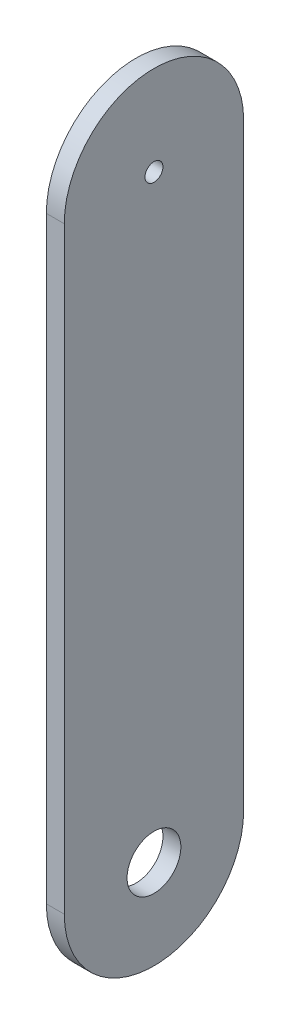
ISO-10303-21;
HEADER;
FILE_DESCRIPTION(('STEP AP214'),'2;1');
FILE_NAME('part.step','',(''),(''),'','','');
FILE_SCHEMA(('AUTOMOTIVE_DESIGN { 1 0 10303 214 1 1 1 1 }'));
ENDSEC;
DATA;
#1=APPLICATION_CONTEXT('core data for automotive mechanical design processes');
#2=APPLICATION_PROTOCOL_DEFINITION('international standard','automotive_design',2000,#1);
#3=PRODUCT_CONTEXT('',#1,'mechanical');
#4=PRODUCT('Part','Part','',(#3));
#5=PRODUCT_RELATED_PRODUCT_CATEGORY('part','',(#4));
#6=PRODUCT_DEFINITION_FORMATION('','',#4);
#7=PRODUCT_DEFINITION_CONTEXT('part definition',#1,'design');
#8=PRODUCT_DEFINITION('design','',#6,#7);
#9=PRODUCT_DEFINITION_SHAPE('','',#8);
#10=(LENGTH_UNIT() NAMED_UNIT(*) SI_UNIT(.MILLI.,.METRE.));
#11=(NAMED_UNIT(*) PLANE_ANGLE_UNIT() SI_UNIT($,.RADIAN.));
#12=(NAMED_UNIT(*) SI_UNIT($,.STERADIAN.) SOLID_ANGLE_UNIT());
#13=UNCERTAINTY_MEASURE_WITH_UNIT(LENGTH_MEASURE(1.E-05),#10,'distance_accuracy_value','');
#14=(GEOMETRIC_REPRESENTATION_CONTEXT(3) GLOBAL_UNCERTAINTY_ASSIGNED_CONTEXT((#13)) GLOBAL_UNIT_ASSIGNED_CONTEXT((#10,
#11,#12)) REPRESENTATION_CONTEXT('',''));
#15=CARTESIAN_POINT('',(0.,0.,0.));
#16=DIRECTION('',(0.,0.,1.));
#17=DIRECTION('',(1.,0.,0.));
#18=AXIS2_PLACEMENT_3D('',#15,#16,#17);
#19=CARTESIAN_POINT('',(3.,-50.,14.8301773529148));
#20=DIRECTION('',(-1.,0.,0.));
#21=DIRECTION('',(0.,0.,1.));
#22=AXIS2_PLACEMENT_3D('',#19,#20,#21);
#23=PLANE('',#22);
#24=CARTESIAN_POINT('',(3.,50.,14.8301773529148));
#25=DIRECTION('',(1.,0.,0.));
#26=DIRECTION('',(0.,0.,-1.));
#27=AXIS2_PLACEMENT_3D('',#24,#25,#26);
#28=CIRCLE('',#27,1.5);
#29=CARTESIAN_POINT('',(3.,50.,13.3301773529148));
#30=VERTEX_POINT('',#29);
#31=EDGE_CURVE('E145',#30,#30,#28,.T.);
#32=ORIENTED_EDGE('',*,*,#31,.F.);
#33=EDGE_LOOP('',(#32));
#34=FACE_BOUND('',#33,.T.);
#35=CARTESIAN_POINT('',(3.,-50.,14.8301773529148));
#36=DIRECTION('',(1.,0.,0.));
#37=DIRECTION('',(0.,0.,1.));
#38=AXIS2_PLACEMENT_3D('',#35,#36,#37);
#39=CIRCLE('',#38,15.);
#40=CARTESIAN_POINT('',(3.,-50.,29.8301773529148));
#41=VERTEX_POINT('',#40);
#42=CARTESIAN_POINT('',(3.,-50.,-0.169822647085245));
#43=VERTEX_POINT('',#42);
#44=EDGE_CURVE('E99',#41,#43,#39,.T.);
#45=ORIENTED_EDGE('',*,*,#44,.T.);
#46=DIRECTION('',(0.,1.,0.));
#47=VECTOR('',#46,1.);
#48=CARTESIAN_POINT('',(3.,50.,-0.169822647085245));
#49=LINE('',#48,#47);
#50=CARTESIAN_POINT('',(3.,50.,-0.169822647085245));
#51=VERTEX_POINT('',#50);
#52=EDGE_CURVE('E94',#43,#51,#49,.T.);
#53=ORIENTED_EDGE('',*,*,#52,.T.);
#54=CARTESIAN_POINT('',(3.,50.,14.8301773529148));
#55=DIRECTION('',(1.,0.,0.));
#56=DIRECTION('',(0.,0.,-1.));
#57=AXIS2_PLACEMENT_3D('',#54,#55,#56);
#58=CIRCLE('',#57,15.);
#59=CARTESIAN_POINT('',(3.,50.,29.8301773529148));
#60=VERTEX_POINT('',#59);
#61=EDGE_CURVE('E97',#51,#60,#58,.T.);
#62=ORIENTED_EDGE('',*,*,#61,.T.);
#63=DIRECTION('',(0.,-1.,0.));
#64=VECTOR('',#63,1.);
#65=CARTESIAN_POINT('',(3.,50.,29.8301773529148));
#66=LINE('',#65,#64);
#67=EDGE_CURVE('E64',#60,#41,#66,.T.);
#68=ORIENTED_EDGE('',*,*,#67,.T.);
#69=EDGE_LOOP('',(#45,#53,#62,#68));
#70=FACE_BOUND('',#69,.T.);
#71=CARTESIAN_POINT('',(3.,-50.,14.8301773529148));
#72=DIRECTION('',(1.,0.,0.));
#73=DIRECTION('',(0.,0.,-1.));
#74=AXIS2_PLACEMENT_3D('',#71,#72,#73);
#75=CIRCLE('',#74,4.5);
#76=CARTESIAN_POINT('',(3.,-50.,10.3301773529148));
#77=VERTEX_POINT('',#76);
#78=EDGE_CURVE('E120',#77,#77,#75,.T.);
#79=ORIENTED_EDGE('',*,*,#78,.F.);
#80=EDGE_LOOP('',(#79));
#81=FACE_BOUND('',#80,.T.);
#82=ADVANCED_FACE('F45',(#34,#70,#81),#23,.F.);
#83=CARTESIAN_POINT('',(0.,-50.,14.8301773529148));
#84=DIRECTION('',(-1.,0.,0.));
#85=DIRECTION('',(0.,0.,1.));
#86=AXIS2_PLACEMENT_3D('',#83,#84,#85);
#87=PLANE('',#86);
#88=CARTESIAN_POINT('',(0.,50.,14.8301773529148));
#89=DIRECTION('',(-1.,0.,0.));
#90=DIRECTION('',(0.,0.,1.));
#91=AXIS2_PLACEMENT_3D('',#88,#89,#90);
#92=CIRCLE('',#91,1.5);
#93=CARTESIAN_POINT('',(0.,50.,16.3301773529148));
#94=VERTEX_POINT('',#93);
#95=EDGE_CURVE('E49',#94,#94,#92,.T.);
#96=ORIENTED_EDGE('',*,*,#95,.F.);
#97=EDGE_LOOP('',(#96));
#98=FACE_BOUND('',#97,.T.);
#99=CARTESIAN_POINT('',(0.,-50.,14.8301773529148));
#100=DIRECTION('',(1.,0.,0.));
#101=DIRECTION('',(0.,0.,1.));
#102=AXIS2_PLACEMENT_3D('',#99,#100,#101);
#103=CIRCLE('',#102,15.);
#104=CARTESIAN_POINT('',(0.,-50.,29.8301773529148));
#105=VERTEX_POINT('',#104);
#106=CARTESIAN_POINT('',(0.,-50.,-0.169822647085245));
#107=VERTEX_POINT('',#106);
#108=EDGE_CURVE('E116',#105,#107,#103,.T.);
#109=ORIENTED_EDGE('',*,*,#108,.F.);
#110=DIRECTION('',(0.,-1.,0.));
#111=VECTOR('',#110,1.);
#112=CARTESIAN_POINT('',(0.,50.,29.8301773529148));
#113=LINE('',#112,#111);
#114=CARTESIAN_POINT('',(0.,50.,29.8301773529148));
#115=VERTEX_POINT('',#114);
#116=EDGE_CURVE('E87',#115,#105,#113,.T.);
#117=ORIENTED_EDGE('',*,*,#116,.F.);
#118=CARTESIAN_POINT('',(0.,50.,14.8301773529148));
#119=DIRECTION('',(1.,0.,0.));
#120=DIRECTION('',(0.,0.,-1.));
#121=AXIS2_PLACEMENT_3D('',#118,#119,#120);
#122=CIRCLE('',#121,15.);
#123=CARTESIAN_POINT('',(0.,50.,-0.169822647085245));
#124=VERTEX_POINT('',#123);
#125=EDGE_CURVE('E81',#124,#115,#122,.T.);
#126=ORIENTED_EDGE('',*,*,#125,.F.);
#127=DIRECTION('',(0.,1.,0.));
#128=VECTOR('',#127,1.);
#129=CARTESIAN_POINT('',(0.,50.,-0.169822647085245));
#130=LINE('',#129,#128);
#131=EDGE_CURVE('E104',#107,#124,#130,.T.);
#132=ORIENTED_EDGE('',*,*,#131,.F.);
#133=EDGE_LOOP('',(#109,#117,#126,#132));
#134=FACE_BOUND('',#133,.T.);
#135=CARTESIAN_POINT('',(0.,-50.,14.8301773529148));
#136=DIRECTION('',(1.,0.,0.));
#137=DIRECTION('',(0.,0.,-1.));
#138=AXIS2_PLACEMENT_3D('',#135,#136,#137);
#139=CIRCLE('',#138,4.5);
#140=CARTESIAN_POINT('',(0.,-50.,10.3301773529148));
#141=VERTEX_POINT('',#140);
#142=EDGE_CURVE('E138',#141,#141,#139,.T.);
#143=ORIENTED_EDGE('',*,*,#142,.T.);
#144=EDGE_LOOP('',(#143));
#145=FACE_BOUND('',#144,.T.);
#146=ADVANCED_FACE('F133',(#98,#134,#145),#87,.T.);
#147=CARTESIAN_POINT('',(3.,-50.,14.8301773529148));
#148=DIRECTION('',(-1.,0.,0.));
#149=DIRECTION('',(0.,0.,1.));
#150=AXIS2_PLACEMENT_3D('',#147,#148,#149);
#151=CYLINDRICAL_SURFACE('',#150,15.);
#152=ORIENTED_EDGE('',*,*,#108,.T.);
#153=DIRECTION('',(-1.,0.,0.));
#154=VECTOR('',#153,1.);
#155=CARTESIAN_POINT('',(3.,-50.,-0.169822647085245));
#156=LINE('',#155,#154);
#157=EDGE_CURVE('E11',#43,#107,#156,.T.);
#158=ORIENTED_EDGE('',*,*,#157,.F.);
#159=ORIENTED_EDGE('',*,*,#44,.F.);
#160=DIRECTION('',(-1.,0.,0.));
#161=VECTOR('',#160,1.);
#162=CARTESIAN_POINT('',(3.,-50.,29.8301773529148));
#163=LINE('',#162,#161);
#164=EDGE_CURVE('E112',#41,#105,#163,.T.);
#165=ORIENTED_EDGE('',*,*,#164,.T.);
#166=EDGE_LOOP('',(#152,#158,#159,#165));
#167=FACE_BOUND('',#166,.T.);
#168=ADVANCED_FACE('F47',(#167),#151,.T.);
#169=CARTESIAN_POINT('',(3.,50.,-0.169822647085245));
#170=DIRECTION('',(0.,0.,1.));
#171=DIRECTION('',(1.,0.,0.));
#172=AXIS2_PLACEMENT_3D('',#169,#170,#171);
#173=PLANE('',#172);
#174=ORIENTED_EDGE('',*,*,#131,.T.);
#175=DIRECTION('',(-1.,0.,0.));
#176=VECTOR('',#175,1.);
#177=CARTESIAN_POINT('',(3.,50.,-0.169822647085245));
#178=LINE('',#177,#176);
#179=EDGE_CURVE('E56',#51,#124,#178,.T.);
#180=ORIENTED_EDGE('',*,*,#179,.F.);
#181=ORIENTED_EDGE('',*,*,#52,.F.);
#182=ORIENTED_EDGE('',*,*,#157,.T.);
#183=EDGE_LOOP('',(#174,#180,#181,#182));
#184=FACE_BOUND('',#183,.T.);
#185=ADVANCED_FACE('F103',(#184),#173,.F.);
#186=CARTESIAN_POINT('',(3.,50.,14.8301773529148));
#187=DIRECTION('',(-1.,0.,0.));
#188=DIRECTION('',(0.,0.,1.));
#189=AXIS2_PLACEMENT_3D('',#186,#187,#188);
#190=CYLINDRICAL_SURFACE('',#189,15.);
#191=ORIENTED_EDGE('',*,*,#125,.T.);
#192=DIRECTION('',(-1.,0.,0.));
#193=VECTOR('',#192,1.);
#194=CARTESIAN_POINT('',(3.,50.,29.8301773529148));
#195=LINE('',#194,#193);
#196=EDGE_CURVE('E106',#60,#115,#195,.T.);
#197=ORIENTED_EDGE('',*,*,#196,.F.);
#198=ORIENTED_EDGE('',*,*,#61,.F.);
#199=ORIENTED_EDGE('',*,*,#179,.T.);
#200=EDGE_LOOP('',(#191,#197,#198,#199));
#201=FACE_BOUND('',#200,.T.);
#202=ADVANCED_FACE('F108',(#201),#190,.T.);
#203=CARTESIAN_POINT('',(3.,50.,29.8301773529148));
#204=DIRECTION('',(0.,0.,-1.));
#205=DIRECTION('',(0.,1.,0.));
#206=AXIS2_PLACEMENT_3D('',#203,#204,#205);
#207=PLANE('',#206);
#208=ORIENTED_EDGE('',*,*,#116,.T.);
#209=ORIENTED_EDGE('',*,*,#164,.F.);
#210=ORIENTED_EDGE('',*,*,#67,.F.);
#211=ORIENTED_EDGE('',*,*,#196,.T.);
#212=EDGE_LOOP('',(#208,#209,#210,#211));
#213=FACE_BOUND('',#212,.T.);
#214=ADVANCED_FACE('F130',(#213),#207,.F.);
#215=CARTESIAN_POINT('',(3.,-50.,14.8301773529148));
#216=DIRECTION('',(-1.,0.,0.));
#217=DIRECTION('',(0.,0.,1.));
#218=AXIS2_PLACEMENT_3D('',#215,#216,#217);
#219=CYLINDRICAL_SURFACE('',#218,4.5);
#220=ORIENTED_EDGE('',*,*,#78,.T.);
#221=EDGE_LOOP('',(#220));
#222=FACE_BOUND('',#221,.T.);
#223=ORIENTED_EDGE('',*,*,#142,.F.);
#224=EDGE_LOOP('',(#223));
#225=FACE_BOUND('',#224,.T.);
#226=ADVANCED_FACE('F169',(#222,#225),#219,.F.);
#227=CARTESIAN_POINT('',(-7.,50.,14.8301773529148));
#228=DIRECTION('',(1.,0.,0.));
#229=DIRECTION('',(0.,0.,-1.));
#230=AXIS2_PLACEMENT_3D('',#227,#228,#229);
#231=CYLINDRICAL_SURFACE('',#230,1.5);
#232=ORIENTED_EDGE('',*,*,#95,.T.);
#233=EDGE_LOOP('',(#232));
#234=FACE_BOUND('',#233,.T.);
#235=ORIENTED_EDGE('',*,*,#31,.T.);
#236=EDGE_LOOP('',(#235));
#237=FACE_BOUND('',#236,.T.);
#238=ADVANCED_FACE('F154',(#234,#237),#231,.F.);
#239=CLOSED_SHELL('',(#82,#146,#168,#185,#202,#214,#226,#238));
#240=MANIFOLD_SOLID_BREP('B2',#239);
#241=ADVANCED_BREP_SHAPE_REPRESENTATION('',(#18,#240),#14);
#242=SHAPE_DEFINITION_REPRESENTATION(#9,#241);
ENDSEC;
END-ISO-10303-21;
